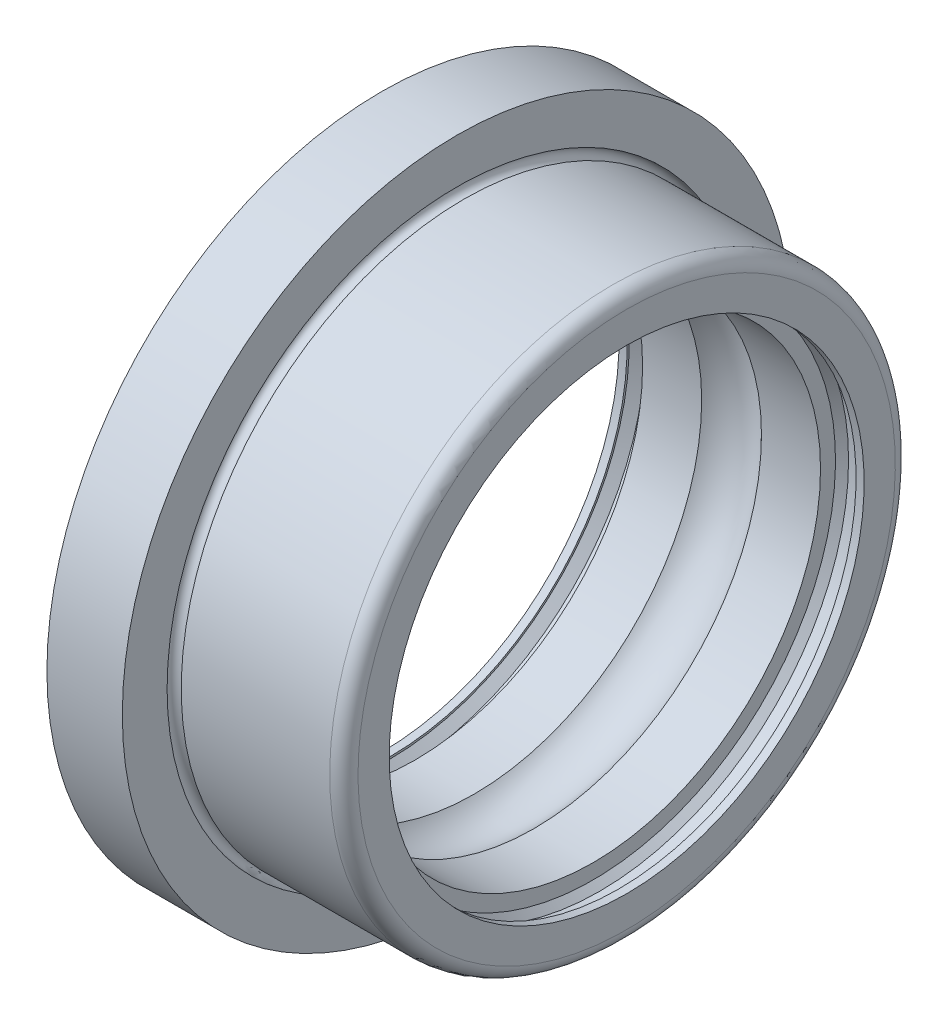
ISO-10303-21;
HEADER;
FILE_DESCRIPTION(('STEP AP214'),'2;1');
FILE_NAME('part.step','',(''),(''),'','','');
FILE_SCHEMA(('AUTOMOTIVE_DESIGN { 1 0 10303 214 1 1 1 1 }'));
ENDSEC;
DATA;
#1=APPLICATION_CONTEXT('core data for automotive mechanical design processes');
#2=APPLICATION_PROTOCOL_DEFINITION('international standard','automotive_design',2000,#1);
#3=PRODUCT_CONTEXT('',#1,'mechanical');
#4=PRODUCT('Part','Part','',(#3));
#5=PRODUCT_RELATED_PRODUCT_CATEGORY('part','',(#4));
#6=PRODUCT_DEFINITION_FORMATION('','',#4);
#7=PRODUCT_DEFINITION_CONTEXT('part definition',#1,'design');
#8=PRODUCT_DEFINITION('design','',#6,#7);
#9=PRODUCT_DEFINITION_SHAPE('','',#8);
#10=(LENGTH_UNIT() NAMED_UNIT(*) SI_UNIT(.MILLI.,.METRE.));
#11=(NAMED_UNIT(*) PLANE_ANGLE_UNIT() SI_UNIT($,.RADIAN.));
#12=(NAMED_UNIT(*) SI_UNIT($,.STERADIAN.) SOLID_ANGLE_UNIT());
#13=UNCERTAINTY_MEASURE_WITH_UNIT(LENGTH_MEASURE(1.E-05),#10,'distance_accuracy_value','');
#14=(GEOMETRIC_REPRESENTATION_CONTEXT(3) GLOBAL_UNCERTAINTY_ASSIGNED_CONTEXT((#13)) GLOBAL_UNIT_ASSIGNED_CONTEXT((#10,
#11,#12)) REPRESENTATION_CONTEXT('',''));
#15=CARTESIAN_POINT('',(0.,0.,0.));
#16=DIRECTION('',(0.,0.,1.));
#17=DIRECTION('',(1.,0.,0.));
#18=AXIS2_PLACEMENT_3D('',#15,#16,#17);
#19=CARTESIAN_POINT('',(-1.3,2.68479020979021,0.));
#20=DIRECTION('',(-1.,0.,0.));
#21=DIRECTION('',(0.,-1.,0.));
#22=AXIS2_PLACEMENT_3D('',#19,#20,#21);
#23=PLANE('',#22);
#24=CARTESIAN_POINT('',(-1.3,0.,0.));
#25=DIRECTION('',(1.,0.,0.));
#26=DIRECTION('',(0.,1.,0.));
#27=AXIS2_PLACEMENT_3D('',#24,#25,#26);
#28=CIRCLE('',#27,2.51958041958042);
#29=CARTESIAN_POINT('',(-1.3,2.51958041958042,0.));
#30=VERTEX_POINT('',#29);
#31=EDGE_CURVE('E11',#30,#30,#28,.T.);
#32=ORIENTED_EDGE('',*,*,#31,.T.);
#33=EDGE_LOOP('',(#32));
#34=FACE_BOUND('',#33,.T.);
#35=CARTESIAN_POINT('',(-1.3,0.,0.));
#36=DIRECTION('',(-1.,0.,0.));
#37=DIRECTION('',(0.,0.,1.));
#38=AXIS2_PLACEMENT_3D('',#35,#36,#37);
#39=CIRCLE('',#38,3.55);
#40=CARTESIAN_POINT('',(-1.3,0.,3.55));
#41=VERTEX_POINT('',#40);
#42=EDGE_CURVE('E129',#41,#41,#39,.T.);
#43=ORIENTED_EDGE('',*,*,#42,.T.);
#44=EDGE_LOOP('',(#43));
#45=FACE_BOUND('',#44,.T.);
#46=ADVANCED_FACE('F19',(#34,#45),#23,.T.);
#47=CARTESIAN_POINT('',(-1.25716783216783,0.,0.));
#48=DIRECTION('',(-1.,0.,0.));
#49=DIRECTION('',(0.,1.,0.));
#50=AXIS2_PLACEMENT_3D('',#47,#48,#49);
#51=CYLINDRICAL_SURFACE('',#50,2.51958041958042);
#52=CARTESIAN_POINT('',(-1.21433566433566,0.,0.));
#53=DIRECTION('',(1.,0.,0.));
#54=DIRECTION('',(0.,1.,0.));
#55=AXIS2_PLACEMENT_3D('',#52,#53,#54);
#56=CIRCLE('',#55,2.51958041958042);
#57=CARTESIAN_POINT('',(-1.21433566433566,2.51958041958042,0.));
#58=VERTEX_POINT('',#57);
#59=EDGE_CURVE('E29',#58,#58,#56,.T.);
#60=ORIENTED_EDGE('',*,*,#59,.T.);
#61=EDGE_LOOP('',(#60));
#62=FACE_BOUND('',#61,.T.);
#63=ORIENTED_EDGE('',*,*,#31,.F.);
#64=EDGE_LOOP('',(#63));
#65=FACE_BOUND('',#64,.T.);
#66=ADVANCED_FACE('F164',(#62,#65),#51,.F.);
#67=CARTESIAN_POINT('',(-1.21561485881621,0.,0.));
#68=DIRECTION('',(-1.,0.,0.));
#69=DIRECTION('',(0.,1.,0.));
#70=AXIS2_PLACEMENT_3D('',#67,#68,#69);
#71=CONICAL_SURFACE('',#70,2.53175114207618,1.46607657167523);
#72=CARTESIAN_POINT('',(-1.21689405329676,0.,0.));
#73=DIRECTION('',(1.,0.,0.));
#74=DIRECTION('',(0.,1.,0.));
#75=AXIS2_PLACEMENT_3D('',#72,#73,#74);
#76=CIRCLE('',#75,2.54392186457195);
#77=CARTESIAN_POINT('',(-1.21689405329676,2.54392186457195,0.));
#78=VERTEX_POINT('',#77);
#79=EDGE_CURVE('E113',#78,#78,#76,.T.);
#80=ORIENTED_EDGE('',*,*,#79,.T.);
#81=EDGE_LOOP('',(#80));
#82=FACE_BOUND('',#81,.T.);
#83=ORIENTED_EDGE('',*,*,#59,.F.);
#84=EDGE_LOOP('',(#83));
#85=FACE_BOUND('',#84,.T.);
#86=ADVANCED_FACE('F169',(#82,#85),#71,.T.);
#87=CARTESIAN_POINT('',(-1.17595074696361,0.,0.));
#88=DIRECTION('',(1.,0.,0.));
#89=DIRECTION('',(0.,1.,0.));
#90=AXIS2_PLACEMENT_3D('',#87,#88,#89);
#91=CONICAL_SURFACE('',#90,2.58939401298403,0.837758040957279);
#92=CARTESIAN_POINT('',(-1.13500744063047,0.,0.));
#93=DIRECTION('',(1.,0.,0.));
#94=DIRECTION('',(0.,1.,0.));
#95=AXIS2_PLACEMENT_3D('',#92,#93,#94);
#96=CIRCLE('',#95,2.63486616139611);
#97=CARTESIAN_POINT('',(-1.13500744063047,2.63486616139611,0.));
#98=VERTEX_POINT('',#97);
#99=EDGE_CURVE('E109',#98,#98,#96,.T.);
#100=ORIENTED_EDGE('',*,*,#99,.T.);
#101=EDGE_LOOP('',(#100));
#102=FACE_BOUND('',#101,.T.);
#103=ORIENTED_EDGE('',*,*,#79,.F.);
#104=EDGE_LOOP('',(#103));
#105=FACE_BOUND('',#104,.T.);
#106=ADVANCED_FACE('F173',(#102,#105),#91,.F.);
#107=CARTESIAN_POINT('',(-1.0739024865808,0.,0.));
#108=DIRECTION('',(1.,0.,0.));
#109=DIRECTION('',(0.,1.,0.));
#110=AXIS2_PLACEMENT_3D('',#107,#108,#109);
#111=CONICAL_SURFACE('',#110,2.63806853634104,0.0523598775598306);
#112=CARTESIAN_POINT('',(-1.01279753253113,0.,0.));
#113=DIRECTION('',(1.,0.,0.));
#114=DIRECTION('',(0.,1.,0.));
#115=AXIS2_PLACEMENT_3D('',#112,#113,#114);
#116=CIRCLE('',#115,2.64127091128598);
#117=CARTESIAN_POINT('',(-1.01279753253113,2.64127091128598,0.));
#118=VERTEX_POINT('',#117);
#119=EDGE_CURVE('E108',#118,#118,#116,.T.);
#120=ORIENTED_EDGE('',*,*,#119,.T.);
#121=EDGE_LOOP('',(#120));
#122=FACE_BOUND('',#121,.T.);
#123=ORIENTED_EDGE('',*,*,#99,.F.);
#124=EDGE_LOOP('',(#123));
#125=FACE_BOUND('',#124,.T.);
#126=ADVANCED_FACE('F202',(#122,#125),#111,.F.);
#127=CARTESIAN_POINT('',(-0.978183913871649,0.,0.));
#128=DIRECTION('',(-1.,0.,0.));
#129=DIRECTION('',(0.,1.,0.));
#130=AXIS2_PLACEMENT_3D('',#127,#128,#129);
#131=CONICAL_SURFACE('',#130,2.6066572926265,0.785398163397449);
#132=CARTESIAN_POINT('',(-0.943570295212168,0.,0.));
#133=DIRECTION('',(1.,0.,0.));
#134=DIRECTION('',(0.,1.,0.));
#135=AXIS2_PLACEMENT_3D('',#132,#133,#134);
#136=CIRCLE('',#135,2.57204367396701);
#137=CARTESIAN_POINT('',(-0.943570295212168,2.57204367396701,0.));
#138=VERTEX_POINT('',#137);
#139=EDGE_CURVE('E110',#138,#138,#136,.T.);
#140=ORIENTED_EDGE('',*,*,#139,.T.);
#141=EDGE_LOOP('',(#140));
#142=FACE_BOUND('',#141,.T.);
#143=ORIENTED_EDGE('',*,*,#119,.F.);
#144=EDGE_LOOP('',(#143));
#145=FACE_BOUND('',#144,.T.);
#146=ADVANCED_FACE('F191',(#142,#145),#131,.F.);
#147=CARTESIAN_POINT('',(-0.943570295212168,2.49249821942156,0.));
#148=DIRECTION('',(-1.,0.,0.));
#149=DIRECTION('',(0.,-1.,0.));
#150=AXIS2_PLACEMENT_3D('',#147,#148,#149);
#151=PLANE('',#150);
#152=CARTESIAN_POINT('',(-0.943570295212168,0.,0.));
#153=DIRECTION('',(1.,0.,0.));
#154=DIRECTION('',(0.,1.,0.));
#155=AXIS2_PLACEMENT_3D('',#152,#153,#154);
#156=CIRCLE('',#155,2.4129527648761);
#157=CARTESIAN_POINT('',(-0.943570295212168,2.4129527648761,0.));
#158=VERTEX_POINT('',#157);
#159=EDGE_CURVE('E121',#158,#158,#156,.T.);
#160=ORIENTED_EDGE('',*,*,#159,.T.);
#161=EDGE_LOOP('',(#160));
#162=FACE_BOUND('',#161,.T.);
#163=ORIENTED_EDGE('',*,*,#139,.F.);
#164=EDGE_LOOP('',(#163));
#165=FACE_BOUND('',#164,.T.);
#166=ADVANCED_FACE('F159',(#162,#165),#151,.T.);
#167=CARTESIAN_POINT('',(-0.630327464765026,0.,0.));
#168=DIRECTION('',(-1.,0.,0.));
#169=DIRECTION('',(0.,1.,0.));
#170=AXIS2_PLACEMENT_3D('',#167,#168,#169);
#171=CYLINDRICAL_SURFACE('',#170,2.4129527648761);
#172=CARTESIAN_POINT('',(-0.317084634317883,0.,0.));
#173=DIRECTION('',(1.,0.,0.));
#174=DIRECTION('',(0.,1.,0.));
#175=AXIS2_PLACEMENT_3D('',#172,#173,#174);
#176=CIRCLE('',#175,2.4129527648761);
#177=CARTESIAN_POINT('',(-0.317084634317883,2.4129527648761,0.));
#178=VERTEX_POINT('',#177);
#179=EDGE_CURVE('E119',#178,#178,#176,.T.);
#180=ORIENTED_EDGE('',*,*,#179,.T.);
#181=EDGE_LOOP('',(#180));
#182=FACE_BOUND('',#181,.T.);
#183=ORIENTED_EDGE('',*,*,#159,.F.);
#184=EDGE_LOOP('',(#183));
#185=FACE_BOUND('',#184,.T.);
#186=ADVANCED_FACE('F144',(#182,#185),#171,.F.);
#187=CARTESIAN_POINT('',(0.,0.,0.));
#188=DIRECTION('',(1.,0.,0.));
#189=DIRECTION('',(0.,0.,-1.));
#190=AXIS2_PLACEMENT_3D('',#187,#188,#189);
#191=TOROIDAL_SURFACE('',#190,2.125,0.428321678321679);
#192=CARTESIAN_POINT('',(0.317084634317884,0.,0.));
#193=DIRECTION('',(1.,0.,0.));
#194=DIRECTION('',(0.,1.,0.));
#195=AXIS2_PLACEMENT_3D('',#192,#193,#194);
#196=CIRCLE('',#195,2.4129527648761);
#197=CARTESIAN_POINT('',(0.317084634317884,2.4129527648761,0.));
#198=VERTEX_POINT('',#197);
#199=EDGE_CURVE('E114',#198,#198,#196,.T.);
#200=ORIENTED_EDGE('',*,*,#199,.T.);
#201=EDGE_LOOP('',(#200));
#202=FACE_BOUND('',#201,.T.);
#203=ORIENTED_EDGE('',*,*,#179,.F.);
#204=EDGE_LOOP('',(#203));
#205=FACE_BOUND('',#204,.T.);
#206=ADVANCED_FACE('F147',(#202,#205),#191,.F.);
#207=CARTESIAN_POINT('',(0.630327464765026,0.,0.));
#208=DIRECTION('',(-1.,0.,0.));
#209=DIRECTION('',(0.,1.,0.));
#210=AXIS2_PLACEMENT_3D('',#207,#208,#209);
#211=CYLINDRICAL_SURFACE('',#210,2.4129527648761);
#212=CARTESIAN_POINT('',(0.943570295212169,0.,0.));
#213=DIRECTION('',(1.,0.,0.));
#214=DIRECTION('',(0.,1.,0.));
#215=AXIS2_PLACEMENT_3D('',#212,#213,#214);
#216=CIRCLE('',#215,2.4129527648761);
#217=CARTESIAN_POINT('',(0.943570295212169,2.4129527648761,0.));
#218=VERTEX_POINT('',#217);
#219=EDGE_CURVE('E68',#218,#218,#216,.T.);
#220=ORIENTED_EDGE('',*,*,#219,.T.);
#221=EDGE_LOOP('',(#220));
#222=FACE_BOUND('',#221,.T.);
#223=ORIENTED_EDGE('',*,*,#199,.F.);
#224=EDGE_LOOP('',(#223));
#225=FACE_BOUND('',#224,.T.);
#226=ADVANCED_FACE('F149',(#222,#225),#211,.F.);
#227=CARTESIAN_POINT('',(0.943570295212169,2.49249821942156,0.));
#228=DIRECTION('',(1.,0.,0.));
#229=DIRECTION('',(0.,1.,0.));
#230=AXIS2_PLACEMENT_3D('',#227,#228,#229);
#231=PLANE('',#230);
#232=CARTESIAN_POINT('',(0.943570295212169,0.,0.));
#233=DIRECTION('',(1.,0.,0.));
#234=DIRECTION('',(0.,1.,0.));
#235=AXIS2_PLACEMENT_3D('',#232,#233,#234);
#236=CIRCLE('',#235,2.57204367396701);
#237=CARTESIAN_POINT('',(0.943570295212169,2.57204367396701,0.));
#238=VERTEX_POINT('',#237);
#239=EDGE_CURVE('E75',#238,#238,#236,.T.);
#240=ORIENTED_EDGE('',*,*,#239,.T.);
#241=EDGE_LOOP('',(#240));
#242=FACE_BOUND('',#241,.T.);
#243=ORIENTED_EDGE('',*,*,#219,.F.);
#244=EDGE_LOOP('',(#243));
#245=FACE_BOUND('',#244,.T.);
#246=ADVANCED_FACE('F157',(#242,#245),#231,.T.);
#247=CARTESIAN_POINT('',(0.97818391387165,0.,0.));
#248=DIRECTION('',(1.,0.,0.));
#249=DIRECTION('',(0.,1.,0.));
#250=AXIS2_PLACEMENT_3D('',#247,#248,#249);
#251=CONICAL_SURFACE('',#250,2.6066572926265,0.785398163397449);
#252=CARTESIAN_POINT('',(1.01279753253113,0.,0.));
#253=DIRECTION('',(1.,0.,0.));
#254=DIRECTION('',(0.,1.,0.));
#255=AXIS2_PLACEMENT_3D('',#252,#253,#254);
#256=CIRCLE('',#255,2.64127091128598);
#257=CARTESIAN_POINT('',(1.01279753253113,2.64127091128598,0.));
#258=VERTEX_POINT('',#257);
#259=EDGE_CURVE('E80',#258,#258,#256,.T.);
#260=ORIENTED_EDGE('',*,*,#259,.T.);
#261=EDGE_LOOP('',(#260));
#262=FACE_BOUND('',#261,.T.);
#263=ORIENTED_EDGE('',*,*,#239,.F.);
#264=EDGE_LOOP('',(#263));
#265=FACE_BOUND('',#264,.T.);
#266=ADVANCED_FACE('F21',(#262,#265),#251,.F.);
#267=CARTESIAN_POINT('',(1.0739024865808,0.,0.));
#268=DIRECTION('',(-1.,0.,0.));
#269=DIRECTION('',(0.,1.,0.));
#270=AXIS2_PLACEMENT_3D('',#267,#268,#269);
#271=CONICAL_SURFACE('',#270,2.63806853634104,0.0523598775598306);
#272=CARTESIAN_POINT('',(1.13500744063047,0.,0.));
#273=DIRECTION('',(1.,0.,0.));
#274=DIRECTION('',(0.,1.,0.));
#275=AXIS2_PLACEMENT_3D('',#272,#273,#274);
#276=CIRCLE('',#275,2.63486616139611);
#277=CARTESIAN_POINT('',(1.13500744063047,2.63486616139611,0.));
#278=VERTEX_POINT('',#277);
#279=EDGE_CURVE('E116',#278,#278,#276,.T.);
#280=ORIENTED_EDGE('',*,*,#279,.T.);
#281=EDGE_LOOP('',(#280));
#282=FACE_BOUND('',#281,.T.);
#283=ORIENTED_EDGE('',*,*,#259,.F.);
#284=EDGE_LOOP('',(#283));
#285=FACE_BOUND('',#284,.T.);
#286=ADVANCED_FACE('F174',(#282,#285),#271,.F.);
#287=CARTESIAN_POINT('',(1.17595074696361,0.,0.));
#288=DIRECTION('',(-1.,0.,0.));
#289=DIRECTION('',(0.,1.,0.));
#290=AXIS2_PLACEMENT_3D('',#287,#288,#289);
#291=CONICAL_SURFACE('',#290,2.58939401298403,0.837758040957279);
#292=CARTESIAN_POINT('',(1.21689405329676,0.,0.));
#293=DIRECTION('',(1.,0.,0.));
#294=DIRECTION('',(0.,1.,0.));
#295=AXIS2_PLACEMENT_3D('',#292,#293,#294);
#296=CIRCLE('',#295,2.54392186457195);
#297=CARTESIAN_POINT('',(1.21689405329676,2.54392186457195,0.));
#298=VERTEX_POINT('',#297);
#299=EDGE_CURVE('E106',#298,#298,#296,.T.);
#300=ORIENTED_EDGE('',*,*,#299,.T.);
#301=EDGE_LOOP('',(#300));
#302=FACE_BOUND('',#301,.T.);
#303=ORIENTED_EDGE('',*,*,#279,.F.);
#304=EDGE_LOOP('',(#303));
#305=FACE_BOUND('',#304,.T.);
#306=ADVANCED_FACE('F176',(#302,#305),#291,.F.);
#307=CARTESIAN_POINT('',(1.21561485881621,0.,0.));
#308=DIRECTION('',(1.,0.,0.));
#309=DIRECTION('',(0.,1.,0.));
#310=AXIS2_PLACEMENT_3D('',#307,#308,#309);
#311=CONICAL_SURFACE('',#310,2.53175114207618,1.46607657167523);
#312=CARTESIAN_POINT('',(1.21433566433566,0.,0.));
#313=DIRECTION('',(1.,0.,0.));
#314=DIRECTION('',(0.,1.,0.));
#315=AXIS2_PLACEMENT_3D('',#312,#313,#314);
#316=CIRCLE('',#315,2.51958041958042);
#317=CARTESIAN_POINT('',(1.21433566433566,2.51958041958042,0.));
#318=VERTEX_POINT('',#317);
#319=EDGE_CURVE('E128',#318,#318,#316,.T.);
#320=ORIENTED_EDGE('',*,*,#319,.T.);
#321=EDGE_LOOP('',(#320));
#322=FACE_BOUND('',#321,.T.);
#323=ORIENTED_EDGE('',*,*,#299,.F.);
#324=EDGE_LOOP('',(#323));
#325=FACE_BOUND('',#324,.T.);
#326=ADVANCED_FACE('F184',(#322,#325),#311,.T.);
#327=CARTESIAN_POINT('',(1.25716783216783,0.,0.));
#328=DIRECTION('',(-1.,0.,0.));
#329=DIRECTION('',(0.,1.,0.));
#330=AXIS2_PLACEMENT_3D('',#327,#328,#329);
#331=CYLINDRICAL_SURFACE('',#330,2.51958041958042);
#332=CARTESIAN_POINT('',(1.3,0.,0.));
#333=DIRECTION('',(1.,0.,0.));
#334=DIRECTION('',(0.,1.,0.));
#335=AXIS2_PLACEMENT_3D('',#332,#333,#334);
#336=CIRCLE('',#335,2.51958041958042);
#337=CARTESIAN_POINT('',(1.3,2.51958041958042,0.));
#338=VERTEX_POINT('',#337);
#339=EDGE_CURVE('E126',#338,#338,#336,.T.);
#340=ORIENTED_EDGE('',*,*,#339,.T.);
#341=EDGE_LOOP('',(#340));
#342=FACE_BOUND('',#341,.T.);
#343=ORIENTED_EDGE('',*,*,#319,.F.);
#344=EDGE_LOOP('',(#343));
#345=FACE_BOUND('',#344,.T.);
#346=ADVANCED_FACE('F186',(#342,#345),#331,.F.);
#347=CARTESIAN_POINT('',(1.3,2.68479020979021,0.));
#348=DIRECTION('',(1.,0.,0.));
#349=DIRECTION('',(0.,1.,0.));
#350=AXIS2_PLACEMENT_3D('',#347,#348,#349);
#351=PLANE('',#350);
#352=CARTESIAN_POINT('',(1.3,0.,0.));
#353=DIRECTION('',(1.,0.,0.));
#354=DIRECTION('',(0.,1.,0.));
#355=AXIS2_PLACEMENT_3D('',#352,#353,#354);
#356=CIRCLE('',#355,2.85);
#357=CARTESIAN_POINT('',(1.3,2.85,0.));
#358=VERTEX_POINT('',#357);
#359=EDGE_CURVE('E123',#358,#358,#356,.T.);
#360=ORIENTED_EDGE('',*,*,#359,.T.);
#361=EDGE_LOOP('',(#360));
#362=FACE_BOUND('',#361,.T.);
#363=ORIENTED_EDGE('',*,*,#339,.F.);
#364=EDGE_LOOP('',(#363));
#365=FACE_BOUND('',#364,.T.);
#366=ADVANCED_FACE('F198',(#362,#365),#351,.T.);
#367=CARTESIAN_POINT('',(1.15,0.,0.));
#368=DIRECTION('',(1.,0.,0.));
#369=DIRECTION('',(0.,0.,-1.));
#370=AXIS2_PLACEMENT_3D('',#367,#368,#369);
#371=TOROIDAL_SURFACE('',#370,2.85,0.15);
#372=CARTESIAN_POINT('',(1.15,0.,0.));
#373=DIRECTION('',(1.,0.,0.));
#374=DIRECTION('',(0.,1.,0.));
#375=AXIS2_PLACEMENT_3D('',#372,#373,#374);
#376=CIRCLE('',#375,3.);
#377=CARTESIAN_POINT('',(1.15,3.,0.));
#378=VERTEX_POINT('',#377);
#379=EDGE_CURVE('E23',#378,#378,#376,.T.);
#380=ORIENTED_EDGE('',*,*,#379,.T.);
#381=EDGE_LOOP('',(#380));
#382=FACE_BOUND('',#381,.T.);
#383=ORIENTED_EDGE('',*,*,#359,.F.);
#384=EDGE_LOOP('',(#383));
#385=FACE_BOUND('',#384,.T.);
#386=ADVANCED_FACE('F216',(#382,#385),#371,.T.);
#387=CARTESIAN_POINT('',(0.,0.,0.));
#388=DIRECTION('',(-1.,0.,0.));
#389=DIRECTION('',(0.,1.,0.));
#390=AXIS2_PLACEMENT_3D('',#387,#388,#389);
#391=CYLINDRICAL_SURFACE('',#390,3.);
#392=ORIENTED_EDGE('',*,*,#379,.F.);
#393=EDGE_LOOP('',(#392));
#394=FACE_BOUND('',#393,.T.);
#395=CARTESIAN_POINT('',(-0.425,0.,0.));
#396=DIRECTION('',(1.,0.,0.));
#397=DIRECTION('',(0.,1.,0.));
#398=AXIS2_PLACEMENT_3D('',#395,#396,#397);
#399=CIRCLE('',#398,3.);
#400=CARTESIAN_POINT('',(-0.425,-3.,0.));
#401=VERTEX_POINT('',#400);
#402=EDGE_CURVE('E97',#401,#401,#399,.T.);
#403=ORIENTED_EDGE('',*,*,#402,.T.);
#404=EDGE_LOOP('',(#403));
#405=FACE_BOUND('',#404,.T.);
#406=ADVANCED_FACE('F98',(#394,#405),#391,.T.);
#407=CARTESIAN_POINT('',(-0.9,0.,0.));
#408=DIRECTION('',(1.,0.,0.));
#409=DIRECTION('',(0.,0.,1.));
#410=AXIS2_PLACEMENT_3D('',#407,#408,#409);
#411=CYLINDRICAL_SURFACE('',#410,3.55);
#412=ORIENTED_EDGE('',*,*,#42,.F.);
#413=EDGE_LOOP('',(#412));
#414=FACE_BOUND('',#413,.T.);
#415=CARTESIAN_POINT('',(-0.5,0.,0.));
#416=DIRECTION('',(1.,0.,0.));
#417=DIRECTION('',(0.,0.,1.));
#418=AXIS2_PLACEMENT_3D('',#415,#416,#417);
#419=CIRCLE('',#418,3.55);
#420=CARTESIAN_POINT('',(-0.5,0.,3.55));
#421=VERTEX_POINT('',#420);
#422=EDGE_CURVE('E102',#421,#421,#419,.T.);
#423=ORIENTED_EDGE('',*,*,#422,.F.);
#424=EDGE_LOOP('',(#423));
#425=FACE_BOUND('',#424,.T.);
#426=ADVANCED_FACE('F183',(#414,#425),#411,.T.);
#427=CARTESIAN_POINT('',(-0.5,0.,0.));
#428=DIRECTION('',(1.,0.,0.));
#429=DIRECTION('',(0.,0.,-1.));
#430=AXIS2_PLACEMENT_3D('',#427,#428,#429);
#431=PLANE('',#430);
#432=ORIENTED_EDGE('',*,*,#422,.T.);
#433=EDGE_LOOP('',(#432));
#434=FACE_BOUND('',#433,.T.);
#435=CARTESIAN_POINT('',(-0.5,0.,0.));
#436=DIRECTION('',(-1.,0.,0.));
#437=DIRECTION('',(0.,0.,-1.));
#438=AXIS2_PLACEMENT_3D('',#435,#436,#437);
#439=CIRCLE('',#438,3.075);
#440=CARTESIAN_POINT('',(-0.5,0.,3.075));
#441=VERTEX_POINT('',#440);
#442=EDGE_CURVE('E100',#441,#441,#439,.T.);
#443=ORIENTED_EDGE('',*,*,#442,.T.);
#444=EDGE_LOOP('',(#443));
#445=FACE_BOUND('',#444,.T.);
#446=ADVANCED_FACE('F179',(#434,#445),#431,.T.);
#447=CARTESIAN_POINT('',(-0.5,0.,0.));
#448=DIRECTION('',(1.,0.,0.));
#449=DIRECTION('',(0.,0.,-1.));
#450=AXIS2_PLACEMENT_3D('',#447,#448,#449);
#451=TOROIDAL_SURFACE('',#450,3.,0.075);
#452=ORIENTED_EDGE('',*,*,#442,.F.);
#453=EDGE_LOOP('',(#452));
#454=FACE_BOUND('',#453,.T.);
#455=ORIENTED_EDGE('',*,*,#402,.F.);
#456=EDGE_LOOP('',(#455));
#457=FACE_BOUND('',#456,.T.);
#458=ADVANCED_FACE('F182',(#454,#457),#451,.F.);
#459=CLOSED_SHELL('',(#46,#66,#86,#106,#126,#146,#166,#186,#206,#226,#246,#266,#286,#306,#326,
#346,#366,#386,#406,#426,#446,#458));
#460=MANIFOLD_SOLID_BREP('B1',#459);
#461=ADVANCED_BREP_SHAPE_REPRESENTATION('',(#18,#460),#14);
#462=SHAPE_DEFINITION_REPRESENTATION(#9,#461);
ENDSEC;
END-ISO-10303-21;
